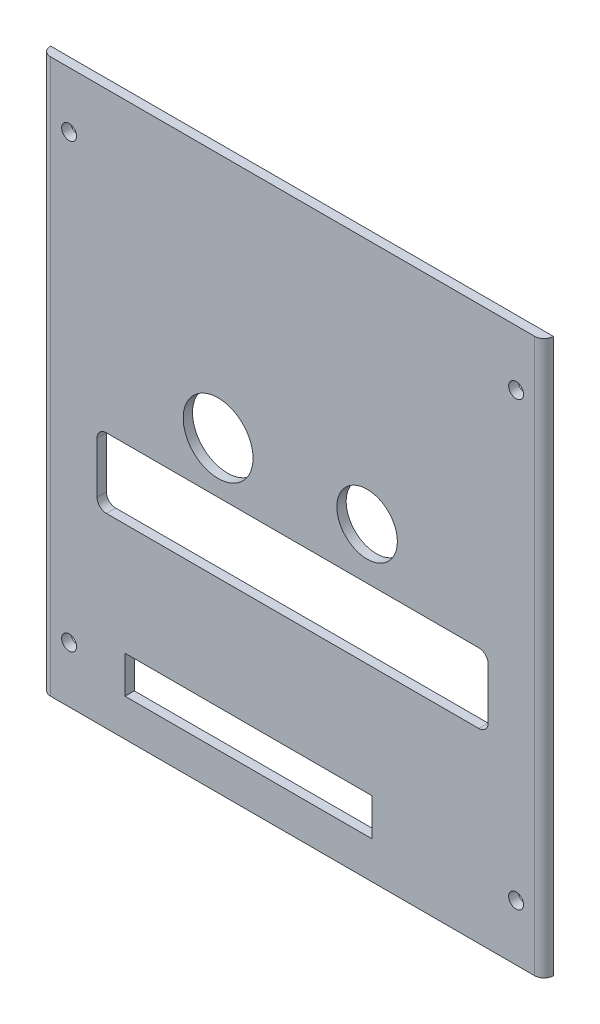
ISO-10303-21;
HEADER;
FILE_DESCRIPTION(('STEP AP214'),'2;1');
FILE_NAME('part.step','',(''),(''),'','','');
FILE_SCHEMA(('AUTOMOTIVE_DESIGN { 1 0 10303 214 1 1 1 1 }'));
ENDSEC;
DATA;
#1=APPLICATION_CONTEXT('core data for automotive mechanical design processes');
#2=APPLICATION_PROTOCOL_DEFINITION('international standard','automotive_design',2000,#1);
#3=PRODUCT_CONTEXT('',#1,'mechanical');
#4=PRODUCT('Part','Part','',(#3));
#5=PRODUCT_RELATED_PRODUCT_CATEGORY('part','',(#4));
#6=PRODUCT_DEFINITION_FORMATION('','',#4);
#7=PRODUCT_DEFINITION_CONTEXT('part definition',#1,'design');
#8=PRODUCT_DEFINITION('design','',#6,#7);
#9=PRODUCT_DEFINITION_SHAPE('','',#8);
#10=(LENGTH_UNIT() NAMED_UNIT(*) SI_UNIT(.MILLI.,.METRE.));
#11=(NAMED_UNIT(*) PLANE_ANGLE_UNIT() SI_UNIT($,.RADIAN.));
#12=(NAMED_UNIT(*) SI_UNIT($,.STERADIAN.) SOLID_ANGLE_UNIT());
#13=UNCERTAINTY_MEASURE_WITH_UNIT(LENGTH_MEASURE(1.E-05),#10,'distance_accuracy_value','');
#14=(GEOMETRIC_REPRESENTATION_CONTEXT(3) GLOBAL_UNCERTAINTY_ASSIGNED_CONTEXT((#13)) GLOBAL_UNIT_ASSIGNED_CONTEXT((#10,
#11,#12)) REPRESENTATION_CONTEXT('',''));
#15=CARTESIAN_POINT('',(0.,0.,0.));
#16=DIRECTION('',(0.,0.,1.));
#17=DIRECTION('',(1.,0.,0.));
#18=AXIS2_PLACEMENT_3D('',#15,#16,#17);
#19=CARTESIAN_POINT('',(0.,0.,2.));
#20=DIRECTION('',(0.,0.,-1.));
#21=DIRECTION('',(-1.,0.,0.));
#22=AXIS2_PLACEMENT_3D('',#19,#20,#21);
#23=PLANE('',#22);
#24=DIRECTION('',(0.,-1.,0.));
#25=VECTOR('',#24,1.);
#26=CARTESIAN_POINT('',(14.,40.,2.));
#27=LINE('',#26,#25);
#28=CARTESIAN_POINT('',(14.,53.,2.));
#29=VERTEX_POINT('',#28);
#30=CARTESIAN_POINT('',(14.,42.,2.));
#31=VERTEX_POINT('',#30);
#32=EDGE_CURVE('E691',#29,#31,#27,.T.);
#33=ORIENTED_EDGE('',*,*,#32,.F.);
#34=CARTESIAN_POINT('',(16.,53.,2.));
#35=DIRECTION('',(0.,0.,-1.));
#36=DIRECTION('',(-1.,0.,0.));
#37=AXIS2_PLACEMENT_3D('',#34,#35,#36);
#38=CIRCLE('',#37,2.);
#39=CARTESIAN_POINT('',(16.,55.,2.));
#40=VERTEX_POINT('',#39);
#41=EDGE_CURVE('E111',#29,#40,#38,.T.);
#42=ORIENTED_EDGE('',*,*,#41,.T.);
#43=DIRECTION('',(-1.,0.,0.));
#44=VECTOR('',#43,1.);
#45=CARTESIAN_POINT('',(56.,55.,2.));
#46=LINE('',#45,#44);
#47=CARTESIAN_POINT('',(96.,55.,2.));
#48=VERTEX_POINT('',#47);
#49=EDGE_CURVE('E358',#48,#40,#46,.T.);
#50=ORIENTED_EDGE('',*,*,#49,.F.);
#51=CARTESIAN_POINT('',(96.,53.,2.));
#52=DIRECTION('',(0.,0.,-1.));
#53=DIRECTION('',(-1.,0.,0.));
#54=AXIS2_PLACEMENT_3D('',#51,#52,#53);
#55=CIRCLE('',#54,2.);
#56=CARTESIAN_POINT('',(98.,53.,2.));
#57=VERTEX_POINT('',#56);
#58=EDGE_CURVE('E282',#48,#57,#55,.T.);
#59=ORIENTED_EDGE('',*,*,#58,.T.);
#60=DIRECTION('',(0.,1.,0.));
#61=VECTOR('',#60,1.);
#62=CARTESIAN_POINT('',(98.,55.,2.));
#63=LINE('',#62,#61);
#64=CARTESIAN_POINT('',(98.,42.,2.));
#65=VERTEX_POINT('',#64);
#66=EDGE_CURVE('E352',#65,#57,#63,.T.);
#67=ORIENTED_EDGE('',*,*,#66,.F.);
#68=CARTESIAN_POINT('',(96.,42.,2.));
#69=DIRECTION('',(0.,0.,-1.));
#70=DIRECTION('',(-1.,0.,0.));
#71=AXIS2_PLACEMENT_3D('',#68,#69,#70);
#72=CIRCLE('',#71,2.);
#73=CARTESIAN_POINT('',(96.,40.,2.));
#74=VERTEX_POINT('',#73);
#75=EDGE_CURVE('E278',#65,#74,#72,.T.);
#76=ORIENTED_EDGE('',*,*,#75,.T.);
#77=DIRECTION('',(1.,0.,0.));
#78=VECTOR('',#77,1.);
#79=CARTESIAN_POINT('',(98.,40.,2.));
#80=LINE('',#79,#78);
#81=CARTESIAN_POINT('',(16.,40.,2.));
#82=VERTEX_POINT('',#81);
#83=EDGE_CURVE('E363',#82,#74,#80,.T.);
#84=ORIENTED_EDGE('',*,*,#83,.F.);
#85=CARTESIAN_POINT('',(16.,42.,2.));
#86=DIRECTION('',(0.,0.,-1.));
#87=DIRECTION('',(-1.,0.,0.));
#88=AXIS2_PLACEMENT_3D('',#85,#86,#87);
#89=CIRCLE('',#88,2.);
#90=EDGE_CURVE('E97',#82,#31,#89,.T.);
#91=ORIENTED_EDGE('',*,*,#90,.T.);
#92=EDGE_LOOP('',(#33,#42,#50,#59,#67,#76,#84,#91));
#93=FACE_BOUND('',#92,.T.);
#94=CARTESIAN_POINT('',(39.9999999999128,66.,2.));
#95=DIRECTION('',(0.,0.,1.));
#96=DIRECTION('',(1.,0.,0.));
#97=AXIS2_PLACEMENT_3D('',#94,#95,#96);
#98=CIRCLE('',#97,7.50000000008344);
#99=CARTESIAN_POINT('',(47.4999999999962,66.,2.));
#100=VERTEX_POINT('',#99);
#101=EDGE_CURVE('E244',#100,#100,#98,.T.);
#102=ORIENTED_EDGE('',*,*,#101,.F.);
#103=EDGE_LOOP('',(#102));
#104=FACE_BOUND('',#103,.T.);
#105=CARTESIAN_POINT('',(71.9999999998928,66.,2.));
#106=DIRECTION('',(0.,0.,1.));
#107=DIRECTION('',(1.,0.,0.));
#108=AXIS2_PLACEMENT_3D('',#105,#106,#107);
#109=CIRCLE('',#108,6.50000000010251);
#110=CARTESIAN_POINT('',(78.4999999999953,66.,2.));
#111=VERTEX_POINT('',#110);
#112=EDGE_CURVE('E359',#111,#111,#109,.T.);
#113=ORIENTED_EDGE('',*,*,#112,.F.);
#114=EDGE_LOOP('',(#113));
#115=FACE_BOUND('',#114,.T.);
#116=CARTESIAN_POINT('',(104.,12.,2.));
#117=DIRECTION('',(0.,0.,1.));
#118=DIRECTION('',(1.,0.,0.));
#119=AXIS2_PLACEMENT_3D('',#116,#117,#118);
#120=CIRCLE('',#119,1.6);
#121=CARTESIAN_POINT('',(105.6,12.,2.));
#122=VERTEX_POINT('',#121);
#123=EDGE_CURVE('E375',#122,#122,#120,.T.);
#124=ORIENTED_EDGE('',*,*,#123,.F.);
#125=EDGE_LOOP('',(#124));
#126=FACE_BOUND('',#125,.T.);
#127=CARTESIAN_POINT('',(7.99999999999999,106.939999999997,2.));
#128=DIRECTION('',(0.,0.,1.));
#129=DIRECTION('',(1.,0.,0.));
#130=AXIS2_PLACEMENT_3D('',#127,#128,#129);
#131=CIRCLE('',#130,1.60000000000079);
#132=CARTESIAN_POINT('',(9.60000000000078,106.939999999997,2.));
#133=VERTEX_POINT('',#132);
#134=EDGE_CURVE('E382',#133,#133,#131,.T.);
#135=ORIENTED_EDGE('',*,*,#134,.F.);
#136=EDGE_LOOP('',(#135));
#137=FACE_BOUND('',#136,.T.);
#138=CARTESIAN_POINT('',(104.,106.939999999997,2.));
#139=DIRECTION('',(0.,0.,1.));
#140=DIRECTION('',(1.,0.,0.));
#141=AXIS2_PLACEMENT_3D('',#138,#139,#140);
#142=CIRCLE('',#141,1.60000000000079);
#143=CARTESIAN_POINT('',(105.600000000001,106.939999999997,2.));
#144=VERTEX_POINT('',#143);
#145=EDGE_CURVE('E369',#144,#144,#142,.T.);
#146=ORIENTED_EDGE('',*,*,#145,.F.);
#147=EDGE_LOOP('',(#146));
#148=FACE_BOUND('',#147,.T.);
#149=CARTESIAN_POINT('',(8.00000000000001,12.,2.));
#150=DIRECTION('',(0.,0.,1.));
#151=DIRECTION('',(1.,0.,0.));
#152=AXIS2_PLACEMENT_3D('',#149,#150,#151);
#153=CIRCLE('',#152,1.6);
#154=CARTESIAN_POINT('',(9.60000000000001,12.,2.));
#155=VERTEX_POINT('',#154);
#156=EDGE_CURVE('E378',#155,#155,#153,.T.);
#157=ORIENTED_EDGE('',*,*,#156,.F.);
#158=EDGE_LOOP('',(#157));
#159=FACE_BOUND('',#158,.T.);
#160=DIRECTION('',(1.,0.,0.));
#161=VECTOR('',#160,1.);
#162=CARTESIAN_POINT('',(4.,0.,2.));
#163=LINE('',#162,#161);
#164=CARTESIAN_POINT('',(3.99999999999867,0.,2.));
#165=VERTEX_POINT('',#164);
#166=CARTESIAN_POINT('',(108.,0.,2.));
#167=VERTEX_POINT('',#166);
#168=EDGE_CURVE('E212',#165,#167,#163,.T.);
#169=ORIENTED_EDGE('',*,*,#168,.T.);
#170=DIRECTION('',(0.,1.,0.));
#171=VECTOR('',#170,1.);
#172=CARTESIAN_POINT('',(108.,0.,2.));
#173=LINE('',#172,#171);
#174=CARTESIAN_POINT('',(108.,118.94,2.));
#175=VERTEX_POINT('',#174);
#176=EDGE_CURVE('E228',#167,#175,#173,.T.);
#177=ORIENTED_EDGE('',*,*,#176,.T.);
#178=DIRECTION('',(-1.,0.,0.));
#179=VECTOR('',#178,1.);
#180=CARTESIAN_POINT('',(4.,118.94,2.));
#181=LINE('',#180,#179);
#182=CARTESIAN_POINT('',(3.99999999999868,118.94,2.));
#183=VERTEX_POINT('',#182);
#184=EDGE_CURVE('E425',#175,#183,#181,.T.);
#185=ORIENTED_EDGE('',*,*,#184,.T.);
#186=DIRECTION('',(0.,-1.,0.));
#187=VECTOR('',#186,1.);
#188=CARTESIAN_POINT('',(3.99999999999867,0.,2.));
#189=LINE('',#188,#187);
#190=EDGE_CURVE('E227',#183,#165,#189,.T.);
#191=ORIENTED_EDGE('',*,*,#190,.T.);
#192=EDGE_LOOP('',(#169,#177,#185,#191));
#193=FACE_BOUND('',#192,.T.);
#194=DIRECTION('',(0.,-1.,0.));
#195=VECTOR('',#194,1.);
#196=CARTESIAN_POINT('',(20.,0.,2.));
#197=LINE('',#196,#195);
#198=CARTESIAN_POINT('',(20.,16.0073463293777,2.));
#199=VERTEX_POINT('',#198);
#200=CARTESIAN_POINT('',(20.,8.,2.));
#201=VERTEX_POINT('',#200);
#202=EDGE_CURVE('E393',#199,#201,#197,.T.);
#203=ORIENTED_EDGE('',*,*,#202,.F.);
#204=DIRECTION('',(-1.,0.,0.));
#205=VECTOR('',#204,1.);
#206=CARTESIAN_POINT('',(0.,16.0073463293777,2.));
#207=LINE('',#206,#205);
#208=CARTESIAN_POINT('',(73.,16.0073463293777,2.));
#209=VERTEX_POINT('',#208);
#210=EDGE_CURVE('E395',#209,#199,#207,.T.);
#211=ORIENTED_EDGE('',*,*,#210,.F.);
#212=DIRECTION('',(0.,-1.,0.));
#213=VECTOR('',#212,1.);
#214=CARTESIAN_POINT('',(73.,0.,2.));
#215=LINE('',#214,#213);
#216=CARTESIAN_POINT('',(73.,8.,2.));
#217=VERTEX_POINT('',#216);
#218=EDGE_CURVE('E398',#209,#217,#215,.T.);
#219=ORIENTED_EDGE('',*,*,#218,.T.);
#220=DIRECTION('',(-1.,0.,0.));
#221=VECTOR('',#220,1.);
#222=CARTESIAN_POINT('',(0.,8.,2.));
#223=LINE('',#222,#221);
#224=EDGE_CURVE('E401',#217,#201,#223,.T.);
#225=ORIENTED_EDGE('',*,*,#224,.T.);
#226=EDGE_LOOP('',(#203,#211,#219,#225));
#227=FACE_BOUND('',#226,.T.);
#228=ADVANCED_FACE('F89',(#93,#104,#115,#126,#137,#148,#159,#193,#227),#23,.F.);
#229=CARTESIAN_POINT('',(0.,0.,0.));
#230=DIRECTION('',(0.,0.,-1.));
#231=DIRECTION('',(-1.,0.,0.));
#232=AXIS2_PLACEMENT_3D('',#229,#230,#231);
#233=PLANE('',#232);
#234=DIRECTION('',(1.,0.,0.));
#235=VECTOR('',#234,1.);
#236=CARTESIAN_POINT('',(0.,55.,0.));
#237=LINE('',#236,#235);
#238=CARTESIAN_POINT('',(16.,55.,0.));
#239=VERTEX_POINT('',#238);
#240=CARTESIAN_POINT('',(96.,55.,0.));
#241=VERTEX_POINT('',#240);
#242=EDGE_CURVE('E256',#239,#241,#237,.T.);
#243=ORIENTED_EDGE('',*,*,#242,.F.);
#244=CARTESIAN_POINT('',(16.,53.,0.));
#245=DIRECTION('',(0.,0.,-1.));
#246=DIRECTION('',(-1.,0.,0.));
#247=AXIS2_PLACEMENT_3D('',#244,#245,#246);
#248=CIRCLE('',#247,2.);
#249=CARTESIAN_POINT('',(14.,53.,0.));
#250=VERTEX_POINT('',#249);
#251=EDGE_CURVE('E287',#239,#250,#248,.F.);
#252=ORIENTED_EDGE('',*,*,#251,.T.);
#253=DIRECTION('',(0.,1.,0.));
#254=VECTOR('',#253,1.);
#255=CARTESIAN_POINT('',(14.,0.,0.));
#256=LINE('',#255,#254);
#257=CARTESIAN_POINT('',(14.,42.,0.));
#258=VERTEX_POINT('',#257);
#259=EDGE_CURVE('E239',#258,#250,#256,.T.);
#260=ORIENTED_EDGE('',*,*,#259,.F.);
#261=CARTESIAN_POINT('',(16.,42.,0.));
#262=DIRECTION('',(0.,0.,-1.));
#263=DIRECTION('',(-1.,0.,0.));
#264=AXIS2_PLACEMENT_3D('',#261,#262,#263);
#265=CIRCLE('',#264,2.);
#266=CARTESIAN_POINT('',(16.,40.,0.));
#267=VERTEX_POINT('',#266);
#268=EDGE_CURVE('E12',#258,#267,#265,.F.);
#269=ORIENTED_EDGE('',*,*,#268,.T.);
#270=DIRECTION('',(-1.,0.,0.));
#271=VECTOR('',#270,1.);
#272=CARTESIAN_POINT('',(0.,40.,0.));
#273=LINE('',#272,#271);
#274=CARTESIAN_POINT('',(96.,40.,0.));
#275=VERTEX_POINT('',#274);
#276=EDGE_CURVE('E250',#275,#267,#273,.T.);
#277=ORIENTED_EDGE('',*,*,#276,.F.);
#278=CARTESIAN_POINT('',(96.,42.,0.));
#279=DIRECTION('',(0.,0.,-1.));
#280=DIRECTION('',(-1.,0.,0.));
#281=AXIS2_PLACEMENT_3D('',#278,#279,#280);
#282=CIRCLE('',#281,2.);
#283=CARTESIAN_POINT('',(98.,42.,0.));
#284=VERTEX_POINT('',#283);
#285=EDGE_CURVE('E280',#275,#284,#282,.F.);
#286=ORIENTED_EDGE('',*,*,#285,.T.);
#287=DIRECTION('',(0.,-1.,0.));
#288=VECTOR('',#287,1.);
#289=CARTESIAN_POINT('',(98.0000000000001,0.,0.));
#290=LINE('',#289,#288);
#291=CARTESIAN_POINT('',(98.,53.,0.));
#292=VERTEX_POINT('',#291);
#293=EDGE_CURVE('E253',#292,#284,#290,.T.);
#294=ORIENTED_EDGE('',*,*,#293,.F.);
#295=CARTESIAN_POINT('',(96.,53.,0.));
#296=DIRECTION('',(0.,0.,-1.));
#297=DIRECTION('',(-1.,0.,0.));
#298=AXIS2_PLACEMENT_3D('',#295,#296,#297);
#299=CIRCLE('',#298,2.);
#300=EDGE_CURVE('E284',#292,#241,#299,.F.);
#301=ORIENTED_EDGE('',*,*,#300,.T.);
#302=EDGE_LOOP('',(#243,#252,#260,#269,#277,#286,#294,#301));
#303=FACE_BOUND('',#302,.T.);
#304=CARTESIAN_POINT('',(39.9999999999128,66.,0.));
#305=DIRECTION('',(0.,0.,-1.));
#306=DIRECTION('',(-1.,0.,0.));
#307=AXIS2_PLACEMENT_3D('',#304,#305,#306);
#308=CIRCLE('',#307,7.50000000008344);
#309=CARTESIAN_POINT('',(32.4999999998293,66.,0.));
#310=VERTEX_POINT('',#309);
#311=EDGE_CURVE('E243',#310,#310,#308,.T.);
#312=ORIENTED_EDGE('',*,*,#311,.F.);
#313=EDGE_LOOP('',(#312));
#314=FACE_BOUND('',#313,.T.);
#315=CARTESIAN_POINT('',(71.9999999998928,66.,0.));
#316=DIRECTION('',(0.,0.,-1.));
#317=DIRECTION('',(-1.,0.,0.));
#318=AXIS2_PLACEMENT_3D('',#315,#316,#317);
#319=CIRCLE('',#318,6.50000000010251);
#320=CARTESIAN_POINT('',(65.4999999997903,66.,0.));
#321=VERTEX_POINT('',#320);
#322=EDGE_CURVE('E240',#321,#321,#319,.T.);
#323=ORIENTED_EDGE('',*,*,#322,.F.);
#324=EDGE_LOOP('',(#323));
#325=FACE_BOUND('',#324,.T.);
#326=CARTESIAN_POINT('',(104.,12.,0.));
#327=DIRECTION('',(0.,0.,1.));
#328=DIRECTION('',(1.,0.,0.));
#329=AXIS2_PLACEMENT_3D('',#326,#327,#328);
#330=CIRCLE('',#329,1.6);
#331=CARTESIAN_POINT('',(105.6,12.,0.));
#332=VERTEX_POINT('',#331);
#333=EDGE_CURVE('E379',#332,#332,#330,.T.);
#334=ORIENTED_EDGE('',*,*,#333,.T.);
#335=EDGE_LOOP('',(#334));
#336=FACE_BOUND('',#335,.T.);
#337=CARTESIAN_POINT('',(7.99999999999999,106.939999999997,0.));
#338=DIRECTION('',(0.,0.,1.));
#339=DIRECTION('',(1.,0.,0.));
#340=AXIS2_PLACEMENT_3D('',#337,#338,#339);
#341=CIRCLE('',#340,1.60000000000079);
#342=CARTESIAN_POINT('',(9.60000000000078,106.939999999997,0.));
#343=VERTEX_POINT('',#342);
#344=EDGE_CURVE('E372',#343,#343,#341,.T.);
#345=ORIENTED_EDGE('',*,*,#344,.T.);
#346=EDGE_LOOP('',(#345));
#347=FACE_BOUND('',#346,.T.);
#348=CARTESIAN_POINT('',(104.,106.939999999997,0.));
#349=DIRECTION('',(0.,0.,1.));
#350=DIRECTION('',(1.,0.,0.));
#351=AXIS2_PLACEMENT_3D('',#348,#349,#350);
#352=CIRCLE('',#351,1.60000000000079);
#353=CARTESIAN_POINT('',(105.600000000001,106.939999999997,0.));
#354=VERTEX_POINT('',#353);
#355=EDGE_CURVE('E247',#354,#354,#352,.T.);
#356=ORIENTED_EDGE('',*,*,#355,.T.);
#357=EDGE_LOOP('',(#356));
#358=FACE_BOUND('',#357,.T.);
#359=CARTESIAN_POINT('',(8.00000000000001,12.,0.));
#360=DIRECTION('',(0.,0.,1.));
#361=DIRECTION('',(1.,0.,0.));
#362=AXIS2_PLACEMENT_3D('',#359,#360,#361);
#363=CIRCLE('',#362,1.6);
#364=CARTESIAN_POINT('',(9.60000000000001,12.,0.));
#365=VERTEX_POINT('',#364);
#366=EDGE_CURVE('E222',#365,#365,#363,.T.);
#367=ORIENTED_EDGE('',*,*,#366,.T.);
#368=EDGE_LOOP('',(#367));
#369=FACE_BOUND('',#368,.T.);
#370=DIRECTION('',(1.,0.,0.));
#371=VECTOR('',#370,1.);
#372=CARTESIAN_POINT('',(4.,0.,0.));
#373=LINE('',#372,#371);
#374=CARTESIAN_POINT('',(1.99999999999867,0.,0.));
#375=VERTEX_POINT('',#374);
#376=CARTESIAN_POINT('',(110.,0.,0.));
#377=VERTEX_POINT('',#376);
#378=EDGE_CURVE('E213',#375,#377,#373,.T.);
#379=ORIENTED_EDGE('',*,*,#378,.F.);
#380=DIRECTION('',(0.,-1.,0.));
#381=VECTOR('',#380,1.);
#382=CARTESIAN_POINT('',(1.99999999999868,118.94,0.));
#383=LINE('',#382,#381);
#384=CARTESIAN_POINT('',(1.99999999999868,118.94,0.));
#385=VERTEX_POINT('',#384);
#386=EDGE_CURVE('E217',#385,#375,#383,.T.);
#387=ORIENTED_EDGE('',*,*,#386,.F.);
#388=DIRECTION('',(-1.,0.,0.));
#389=VECTOR('',#388,1.);
#390=CARTESIAN_POINT('',(4.,118.94,0.));
#391=LINE('',#390,#389);
#392=CARTESIAN_POINT('',(110.,118.94,0.));
#393=VERTEX_POINT('',#392);
#394=EDGE_CURVE('E201',#393,#385,#391,.T.);
#395=ORIENTED_EDGE('',*,*,#394,.F.);
#396=DIRECTION('',(0.,1.,0.));
#397=VECTOR('',#396,1.);
#398=CARTESIAN_POINT('',(110.,0.,0.));
#399=LINE('',#398,#397);
#400=EDGE_CURVE('E221',#377,#393,#399,.T.);
#401=ORIENTED_EDGE('',*,*,#400,.F.);
#402=EDGE_LOOP('',(#379,#387,#395,#401));
#403=FACE_BOUND('',#402,.T.);
#404=DIRECTION('',(-1.,0.,0.));
#405=VECTOR('',#404,1.);
#406=CARTESIAN_POINT('',(0.,16.0073463293777,0.));
#407=LINE('',#406,#405);
#408=CARTESIAN_POINT('',(73.,16.0073463293777,0.));
#409=VERTEX_POINT('',#408);
#410=CARTESIAN_POINT('',(20.,16.0073463293777,0.));
#411=VERTEX_POINT('',#410);
#412=EDGE_CURVE('E407',#409,#411,#407,.T.);
#413=ORIENTED_EDGE('',*,*,#412,.T.);
#414=DIRECTION('',(0.,-1.,0.));
#415=VECTOR('',#414,1.);
#416=CARTESIAN_POINT('',(20.,0.,0.));
#417=LINE('',#416,#415);
#418=CARTESIAN_POINT('',(20.,8.,0.));
#419=VERTEX_POINT('',#418);
#420=EDGE_CURVE('E392',#411,#419,#417,.T.);
#421=ORIENTED_EDGE('',*,*,#420,.T.);
#422=DIRECTION('',(-1.,0.,0.));
#423=VECTOR('',#422,1.);
#424=CARTESIAN_POINT('',(0.,8.,0.));
#425=LINE('',#424,#423);
#426=CARTESIAN_POINT('',(73.,8.,0.));
#427=VERTEX_POINT('',#426);
#428=EDGE_CURVE('E396',#427,#419,#425,.T.);
#429=ORIENTED_EDGE('',*,*,#428,.F.);
#430=DIRECTION('',(0.,-1.,0.));
#431=VECTOR('',#430,1.);
#432=CARTESIAN_POINT('',(73.,0.,0.));
#433=LINE('',#432,#431);
#434=EDGE_CURVE('E410',#409,#427,#433,.T.);
#435=ORIENTED_EDGE('',*,*,#434,.F.);
#436=EDGE_LOOP('',(#413,#421,#429,#435));
#437=FACE_BOUND('',#436,.T.);
#438=ADVANCED_FACE('F218',(#303,#314,#325,#336,#347,#358,#369,#403,#437),#233,.T.);
#439=CARTESIAN_POINT('',(4.,0.,2.));
#440=DIRECTION('',(0.,1.,0.));
#441=DIRECTION('',(0.,0.,1.));
#442=AXIS2_PLACEMENT_3D('',#439,#440,#441);
#443=PLANE('',#442);
#444=ORIENTED_EDGE('',*,*,#378,.T.);
#445=CARTESIAN_POINT('',(108.,0.,0.));
#446=DIRECTION('',(0.,1.,0.));
#447=DIRECTION('',(0.,0.,1.));
#448=AXIS2_PLACEMENT_3D('',#445,#446,#447);
#449=CIRCLE('',#448,2.);
#450=EDGE_CURVE('E237',#377,#167,#449,.F.);
#451=ORIENTED_EDGE('',*,*,#450,.T.);
#452=ORIENTED_EDGE('',*,*,#168,.F.);
#453=CARTESIAN_POINT('',(3.99999999999867,0.,0.));
#454=DIRECTION('',(0.,1.,0.));
#455=DIRECTION('',(0.,0.,1.));
#456=AXIS2_PLACEMENT_3D('',#453,#454,#455);
#457=CIRCLE('',#456,2.);
#458=EDGE_CURVE('E230',#165,#375,#457,.F.);
#459=ORIENTED_EDGE('',*,*,#458,.T.);
#460=EDGE_LOOP('',(#444,#451,#452,#459));
#461=FACE_BOUND('',#460,.T.);
#462=ADVANCED_FACE('F314',(#461),#443,.F.);
#463=CARTESIAN_POINT('',(4.,118.94,2.));
#464=DIRECTION('',(0.,-1.,0.));
#465=DIRECTION('',(0.,0.,-1.));
#466=AXIS2_PLACEMENT_3D('',#463,#464,#465);
#467=PLANE('',#466);
#468=ORIENTED_EDGE('',*,*,#184,.F.);
#469=CARTESIAN_POINT('',(108.,118.94,0.));
#470=DIRECTION('',(0.,-1.,0.));
#471=DIRECTION('',(0.,0.,-1.));
#472=AXIS2_PLACEMENT_3D('',#469,#470,#471);
#473=CIRCLE('',#472,2.);
#474=EDGE_CURVE('E208',#175,#393,#473,.F.);
#475=ORIENTED_EDGE('',*,*,#474,.T.);
#476=ORIENTED_EDGE('',*,*,#394,.T.);
#477=CARTESIAN_POINT('',(3.99999999999868,118.94,0.));
#478=DIRECTION('',(0.,-1.,0.));
#479=DIRECTION('',(0.,0.,-1.));
#480=AXIS2_PLACEMENT_3D('',#477,#478,#479);
#481=CIRCLE('',#480,2.);
#482=EDGE_CURVE('E206',#385,#183,#481,.F.);
#483=ORIENTED_EDGE('',*,*,#482,.T.);
#484=EDGE_LOOP('',(#468,#475,#476,#483));
#485=FACE_BOUND('',#484,.T.);
#486=ADVANCED_FACE('F204',(#485),#467,.F.);
#487=CARTESIAN_POINT('',(20.,0.,2.));
#488=DIRECTION('',(1.,0.,0.));
#489=DIRECTION('',(0.,0.,-1.));
#490=AXIS2_PLACEMENT_3D('',#487,#488,#489);
#491=PLANE('',#490);
#492=ORIENTED_EDGE('',*,*,#420,.F.);
#493=DIRECTION('',(0.,0.,-1.));
#494=VECTOR('',#493,1.);
#495=CARTESIAN_POINT('',(20.,16.0073463293777,2.));
#496=LINE('',#495,#494);
#497=EDGE_CURVE('E404',#199,#411,#496,.T.);
#498=ORIENTED_EDGE('',*,*,#497,.F.);
#499=ORIENTED_EDGE('',*,*,#202,.T.);
#500=DIRECTION('',(0.,0.,-1.));
#501=VECTOR('',#500,1.);
#502=CARTESIAN_POINT('',(20.,8.,2.));
#503=LINE('',#502,#501);
#504=EDGE_CURVE('E415',#201,#419,#503,.T.);
#505=ORIENTED_EDGE('',*,*,#504,.T.);
#506=EDGE_LOOP('',(#492,#498,#499,#505));
#507=FACE_BOUND('',#506,.T.);
#508=ADVANCED_FACE('F318',(#507),#491,.T.);
#509=CARTESIAN_POINT('',(0.,8.,2.));
#510=DIRECTION('',(0.,-1.,0.));
#511=DIRECTION('',(0.,0.,-1.));
#512=AXIS2_PLACEMENT_3D('',#509,#510,#511);
#513=PLANE('',#512);
#514=ORIENTED_EDGE('',*,*,#428,.T.);
#515=ORIENTED_EDGE('',*,*,#504,.F.);
#516=ORIENTED_EDGE('',*,*,#224,.F.);
#517=DIRECTION('',(0.,0.,-1.));
#518=VECTOR('',#517,1.);
#519=CARTESIAN_POINT('',(73.,8.,2.));
#520=LINE('',#519,#518);
#521=EDGE_CURVE('E417',#217,#427,#520,.T.);
#522=ORIENTED_EDGE('',*,*,#521,.T.);
#523=EDGE_LOOP('',(#514,#515,#516,#522));
#524=FACE_BOUND('',#523,.T.);
#525=ADVANCED_FACE('F439',(#524),#513,.F.);
#526=CARTESIAN_POINT('',(73.,0.,2.));
#527=DIRECTION('',(1.,0.,0.));
#528=DIRECTION('',(0.,0.,-1.));
#529=AXIS2_PLACEMENT_3D('',#526,#527,#528);
#530=PLANE('',#529);
#531=ORIENTED_EDGE('',*,*,#434,.T.);
#532=ORIENTED_EDGE('',*,*,#521,.F.);
#533=ORIENTED_EDGE('',*,*,#218,.F.);
#534=DIRECTION('',(0.,0.,-1.));
#535=VECTOR('',#534,1.);
#536=CARTESIAN_POINT('',(73.,16.0073463293777,2.));
#537=LINE('',#536,#535);
#538=EDGE_CURVE('E419',#209,#409,#537,.T.);
#539=ORIENTED_EDGE('',*,*,#538,.T.);
#540=EDGE_LOOP('',(#531,#532,#533,#539));
#541=FACE_BOUND('',#540,.T.);
#542=ADVANCED_FACE('F447',(#541),#530,.F.);
#543=CARTESIAN_POINT('',(0.,16.0073463293777,2.));
#544=DIRECTION('',(0.,-1.,0.));
#545=DIRECTION('',(1.,0.,0.));
#546=AXIS2_PLACEMENT_3D('',#543,#544,#545);
#547=PLANE('',#546);
#548=ORIENTED_EDGE('',*,*,#412,.F.);
#549=ORIENTED_EDGE('',*,*,#538,.F.);
#550=ORIENTED_EDGE('',*,*,#210,.T.);
#551=ORIENTED_EDGE('',*,*,#497,.T.);
#552=EDGE_LOOP('',(#548,#549,#550,#551));
#553=FACE_BOUND('',#552,.T.);
#554=ADVANCED_FACE('F444',(#553),#547,.T.);
#555=CARTESIAN_POINT('',(8.00000000000001,12.,0.));
#556=DIRECTION('',(0.,0.,1.));
#557=DIRECTION('',(1.,0.,0.));
#558=AXIS2_PLACEMENT_3D('',#555,#556,#557);
#559=CYLINDRICAL_SURFACE('',#558,1.6);
#560=ORIENTED_EDGE('',*,*,#366,.F.);
#561=EDGE_LOOP('',(#560));
#562=FACE_BOUND('',#561,.T.);
#563=ORIENTED_EDGE('',*,*,#156,.T.);
#564=EDGE_LOOP('',(#563));
#565=FACE_BOUND('',#564,.T.);
#566=ADVANCED_FACE('F454',(#562,#565),#559,.F.);
#567=CARTESIAN_POINT('',(104.,106.939999999997,0.));
#568=DIRECTION('',(0.,0.,1.));
#569=DIRECTION('',(1.,0.,0.));
#570=AXIS2_PLACEMENT_3D('',#567,#568,#569);
#571=CYLINDRICAL_SURFACE('',#570,1.60000000000079);
#572=ORIENTED_EDGE('',*,*,#355,.F.);
#573=EDGE_LOOP('',(#572));
#574=FACE_BOUND('',#573,.T.);
#575=ORIENTED_EDGE('',*,*,#145,.T.);
#576=EDGE_LOOP('',(#575));
#577=FACE_BOUND('',#576,.T.);
#578=ADVANCED_FACE('F459',(#574,#577),#571,.F.);
#579=CARTESIAN_POINT('',(7.99999999999999,106.939999999997,0.));
#580=DIRECTION('',(0.,0.,1.));
#581=DIRECTION('',(1.,0.,0.));
#582=AXIS2_PLACEMENT_3D('',#579,#580,#581);
#583=CYLINDRICAL_SURFACE('',#582,1.60000000000079);
#584=ORIENTED_EDGE('',*,*,#344,.F.);
#585=EDGE_LOOP('',(#584));
#586=FACE_BOUND('',#585,.T.);
#587=ORIENTED_EDGE('',*,*,#134,.T.);
#588=EDGE_LOOP('',(#587));
#589=FACE_BOUND('',#588,.T.);
#590=ADVANCED_FACE('F461',(#586,#589),#583,.F.);
#591=CARTESIAN_POINT('',(104.,12.,0.));
#592=DIRECTION('',(0.,0.,1.));
#593=DIRECTION('',(1.,0.,0.));
#594=AXIS2_PLACEMENT_3D('',#591,#592,#593);
#595=CYLINDRICAL_SURFACE('',#594,1.6);
#596=ORIENTED_EDGE('',*,*,#333,.F.);
#597=EDGE_LOOP('',(#596));
#598=FACE_BOUND('',#597,.T.);
#599=ORIENTED_EDGE('',*,*,#123,.T.);
#600=EDGE_LOOP('',(#599));
#601=FACE_BOUND('',#600,.T.);
#602=ADVANCED_FACE('F329',(#598,#601),#595,.F.);
#603=CARTESIAN_POINT('',(108.,0.,0.));
#604=DIRECTION('',(0.,1.,0.));
#605=DIRECTION('',(-1.,0.,0.));
#606=AXIS2_PLACEMENT_3D('',#603,#604,#605);
#607=CYLINDRICAL_SURFACE('',#606,2.);
#608=ORIENTED_EDGE('',*,*,#450,.F.);
#609=ORIENTED_EDGE('',*,*,#400,.T.);
#610=ORIENTED_EDGE('',*,*,#474,.F.);
#611=ORIENTED_EDGE('',*,*,#176,.F.);
#612=EDGE_LOOP('',(#608,#609,#610,#611));
#613=FACE_BOUND('',#612,.T.);
#614=ADVANCED_FACE('F326',(#613),#607,.T.);
#615=CARTESIAN_POINT('',(3.99999999999867,0.,0.));
#616=DIRECTION('',(0.,-1.,0.));
#617=DIRECTION('',(1.,0.,0.));
#618=AXIS2_PLACEMENT_3D('',#615,#616,#617);
#619=CYLINDRICAL_SURFACE('',#618,2.);
#620=ORIENTED_EDGE('',*,*,#482,.F.);
#621=ORIENTED_EDGE('',*,*,#386,.T.);
#622=ORIENTED_EDGE('',*,*,#458,.F.);
#623=ORIENTED_EDGE('',*,*,#190,.F.);
#624=EDGE_LOOP('',(#620,#621,#622,#623));
#625=FACE_BOUND('',#624,.T.);
#626=ADVANCED_FACE('F225',(#625),#619,.T.);
#627=CARTESIAN_POINT('',(71.9999999998928,66.,-10.));
#628=DIRECTION('',(0.,0.,1.));
#629=DIRECTION('',(1.,0.,0.));
#630=AXIS2_PLACEMENT_3D('',#627,#628,#629);
#631=CYLINDRICAL_SURFACE('',#630,6.50000000010251);
#632=ORIENTED_EDGE('',*,*,#322,.T.);
#633=EDGE_LOOP('',(#632));
#634=FACE_BOUND('',#633,.T.);
#635=ORIENTED_EDGE('',*,*,#112,.T.);
#636=EDGE_LOOP('',(#635));
#637=FACE_BOUND('',#636,.T.);
#638=ADVANCED_FACE('F333',(#634,#637),#631,.F.);
#639=CARTESIAN_POINT('',(39.9999999999128,66.,-10.));
#640=DIRECTION('',(0.,0.,1.));
#641=DIRECTION('',(1.,0.,0.));
#642=AXIS2_PLACEMENT_3D('',#639,#640,#641);
#643=CYLINDRICAL_SURFACE('',#642,7.50000000008344);
#644=ORIENTED_EDGE('',*,*,#311,.T.);
#645=EDGE_LOOP('',(#644));
#646=FACE_BOUND('',#645,.T.);
#647=ORIENTED_EDGE('',*,*,#101,.T.);
#648=EDGE_LOOP('',(#647));
#649=FACE_BOUND('',#648,.T.);
#650=ADVANCED_FACE('F473',(#646,#649),#643,.F.);
#651=CARTESIAN_POINT('',(56.,55.,-10.));
#652=DIRECTION('',(0.,1.,0.));
#653=DIRECTION('',(0.,0.,1.));
#654=AXIS2_PLACEMENT_3D('',#651,#652,#653);
#655=PLANE('',#654);
#656=ORIENTED_EDGE('',*,*,#242,.T.);
#657=DIRECTION('',(0.,0.,1.));
#658=VECTOR('',#657,1.);
#659=CARTESIAN_POINT('',(96.,55.,2.));
#660=LINE('',#659,#658);
#661=EDGE_CURVE('E271',#241,#48,#660,.T.);
#662=ORIENTED_EDGE('',*,*,#661,.T.);
#663=ORIENTED_EDGE('',*,*,#49,.T.);
#664=DIRECTION('',(0.,0.,1.));
#665=VECTOR('',#664,1.);
#666=CARTESIAN_POINT('',(16.,55.,0.));
#667=LINE('',#666,#665);
#668=EDGE_CURVE('E269',#40,#239,#667,.F.);
#669=ORIENTED_EDGE('',*,*,#668,.T.);
#670=EDGE_LOOP('',(#656,#662,#663,#669));
#671=FACE_BOUND('',#670,.T.);
#672=ADVANCED_FACE('F355',(#671),#655,.F.);
#673=CARTESIAN_POINT('',(98.,55.,-10.));
#674=DIRECTION('',(1.,0.,0.));
#675=DIRECTION('',(0.,1.,0.));
#676=AXIS2_PLACEMENT_3D('',#673,#674,#675);
#677=PLANE('',#676);
#678=ORIENTED_EDGE('',*,*,#293,.T.);
#679=DIRECTION('',(0.,0.,1.));
#680=VECTOR('',#679,1.);
#681=CARTESIAN_POINT('',(98.,42.,2.));
#682=LINE('',#681,#680);
#683=EDGE_CURVE('E261',#284,#65,#682,.T.);
#684=ORIENTED_EDGE('',*,*,#683,.T.);
#685=ORIENTED_EDGE('',*,*,#66,.T.);
#686=DIRECTION('',(0.,0.,1.));
#687=VECTOR('',#686,1.);
#688=CARTESIAN_POINT('',(98.,53.,0.));
#689=LINE('',#688,#687);
#690=EDGE_CURVE('E259',#57,#292,#689,.F.);
#691=ORIENTED_EDGE('',*,*,#690,.T.);
#692=EDGE_LOOP('',(#678,#684,#685,#691));
#693=FACE_BOUND('',#692,.T.);
#694=ADVANCED_FACE('F348',(#693),#677,.F.);
#695=CARTESIAN_POINT('',(98.,40.,-10.));
#696=DIRECTION('',(0.,-1.,0.));
#697=DIRECTION('',(1.,0.,0.));
#698=AXIS2_PLACEMENT_3D('',#695,#696,#697);
#699=PLANE('',#698);
#700=ORIENTED_EDGE('',*,*,#83,.T.);
#701=DIRECTION('',(0.,0.,1.));
#702=VECTOR('',#701,1.);
#703=CARTESIAN_POINT('',(96.,40.,0.));
#704=LINE('',#703,#702);
#705=EDGE_CURVE('E267',#74,#275,#704,.F.);
#706=ORIENTED_EDGE('',*,*,#705,.T.);
#707=ORIENTED_EDGE('',*,*,#276,.T.);
#708=DIRECTION('',(0.,0.,1.));
#709=VECTOR('',#708,1.);
#710=CARTESIAN_POINT('',(16.,40.,2.));
#711=LINE('',#710,#709);
#712=EDGE_CURVE('E264',#267,#82,#711,.T.);
#713=ORIENTED_EDGE('',*,*,#712,.T.);
#714=EDGE_LOOP('',(#700,#706,#707,#713));
#715=FACE_BOUND('',#714,.T.);
#716=ADVANCED_FACE('F339',(#715),#699,.F.);
#717=CARTESIAN_POINT('',(14.,40.,-10.));
#718=DIRECTION('',(-1.,0.,0.));
#719=DIRECTION('',(0.,-1.,0.));
#720=AXIS2_PLACEMENT_3D('',#717,#718,#719);
#721=PLANE('',#720);
#722=ORIENTED_EDGE('',*,*,#259,.T.);
#723=DIRECTION('',(0.,0.,1.));
#724=VECTOR('',#723,1.);
#725=CARTESIAN_POINT('',(14.,53.,2.));
#726=LINE('',#725,#724);
#727=EDGE_CURVE('E276',#250,#29,#726,.T.);
#728=ORIENTED_EDGE('',*,*,#727,.T.);
#729=ORIENTED_EDGE('',*,*,#32,.T.);
#730=DIRECTION('',(0.,0.,1.));
#731=VECTOR('',#730,1.);
#732=CARTESIAN_POINT('',(14.,42.,0.));
#733=LINE('',#732,#731);
#734=EDGE_CURVE('E274',#31,#258,#733,.F.);
#735=ORIENTED_EDGE('',*,*,#734,.T.);
#736=EDGE_LOOP('',(#722,#728,#729,#735));
#737=FACE_BOUND('',#736,.T.);
#738=ADVANCED_FACE('F295',(#737),#721,.F.);
#739=CARTESIAN_POINT('',(96.,42.,-10.));
#740=DIRECTION('',(0.,0.,-1.));
#741=DIRECTION('',(-1.,0.,0.));
#742=AXIS2_PLACEMENT_3D('',#739,#740,#741);
#743=CYLINDRICAL_SURFACE('',#742,2.);
#744=ORIENTED_EDGE('',*,*,#285,.F.);
#745=ORIENTED_EDGE('',*,*,#705,.F.);
#746=ORIENTED_EDGE('',*,*,#75,.F.);
#747=ORIENTED_EDGE('',*,*,#683,.F.);
#748=EDGE_LOOP('',(#744,#745,#746,#747));
#749=FACE_BOUND('',#748,.T.);
#750=ADVANCED_FACE('F305',(#749),#743,.F.);
#751=CARTESIAN_POINT('',(96.,53.,-10.));
#752=DIRECTION('',(0.,0.,-1.));
#753=DIRECTION('',(-1.,0.,0.));
#754=AXIS2_PLACEMENT_3D('',#751,#752,#753);
#755=CYLINDRICAL_SURFACE('',#754,2.);
#756=ORIENTED_EDGE('',*,*,#300,.F.);
#757=ORIENTED_EDGE('',*,*,#690,.F.);
#758=ORIENTED_EDGE('',*,*,#58,.F.);
#759=ORIENTED_EDGE('',*,*,#661,.F.);
#760=EDGE_LOOP('',(#756,#757,#758,#759));
#761=FACE_BOUND('',#760,.T.);
#762=ADVANCED_FACE('F299',(#761),#755,.F.);
#763=CARTESIAN_POINT('',(16.,53.,-10.));
#764=DIRECTION('',(0.,0.,-1.));
#765=DIRECTION('',(-1.,0.,0.));
#766=AXIS2_PLACEMENT_3D('',#763,#764,#765);
#767=CYLINDRICAL_SURFACE('',#766,2.);
#768=ORIENTED_EDGE('',*,*,#251,.F.);
#769=ORIENTED_EDGE('',*,*,#668,.F.);
#770=ORIENTED_EDGE('',*,*,#41,.F.);
#771=ORIENTED_EDGE('',*,*,#727,.F.);
#772=EDGE_LOOP('',(#768,#769,#770,#771));
#773=FACE_BOUND('',#772,.T.);
#774=ADVANCED_FACE('F297',(#773),#767,.F.);
#775=CARTESIAN_POINT('',(16.,42.,-10.));
#776=DIRECTION('',(0.,0.,-1.));
#777=DIRECTION('',(-1.,0.,0.));
#778=AXIS2_PLACEMENT_3D('',#775,#776,#777);
#779=CYLINDRICAL_SURFACE('',#778,2.);
#780=ORIENTED_EDGE('',*,*,#268,.F.);
#781=ORIENTED_EDGE('',*,*,#734,.F.);
#782=ORIENTED_EDGE('',*,*,#90,.F.);
#783=ORIENTED_EDGE('',*,*,#712,.F.);
#784=EDGE_LOOP('',(#780,#781,#782,#783));
#785=FACE_BOUND('',#784,.T.);
#786=ADVANCED_FACE('F91',(#785),#779,.F.);
#787=CLOSED_SHELL('',(#228,#438,#462,#486,#508,#525,#542,#554,#566,#578,#590,#602,#614,#626,
#638,#650,#672,#694,#716,#738,#750,#762,#774,#786));
#788=MANIFOLD_SOLID_BREP('B2',#787);
#789=ADVANCED_BREP_SHAPE_REPRESENTATION('',(#18,#788),#14);
#790=SHAPE_DEFINITION_REPRESENTATION(#9,#789);
ENDSEC;
END-ISO-10303-21;
